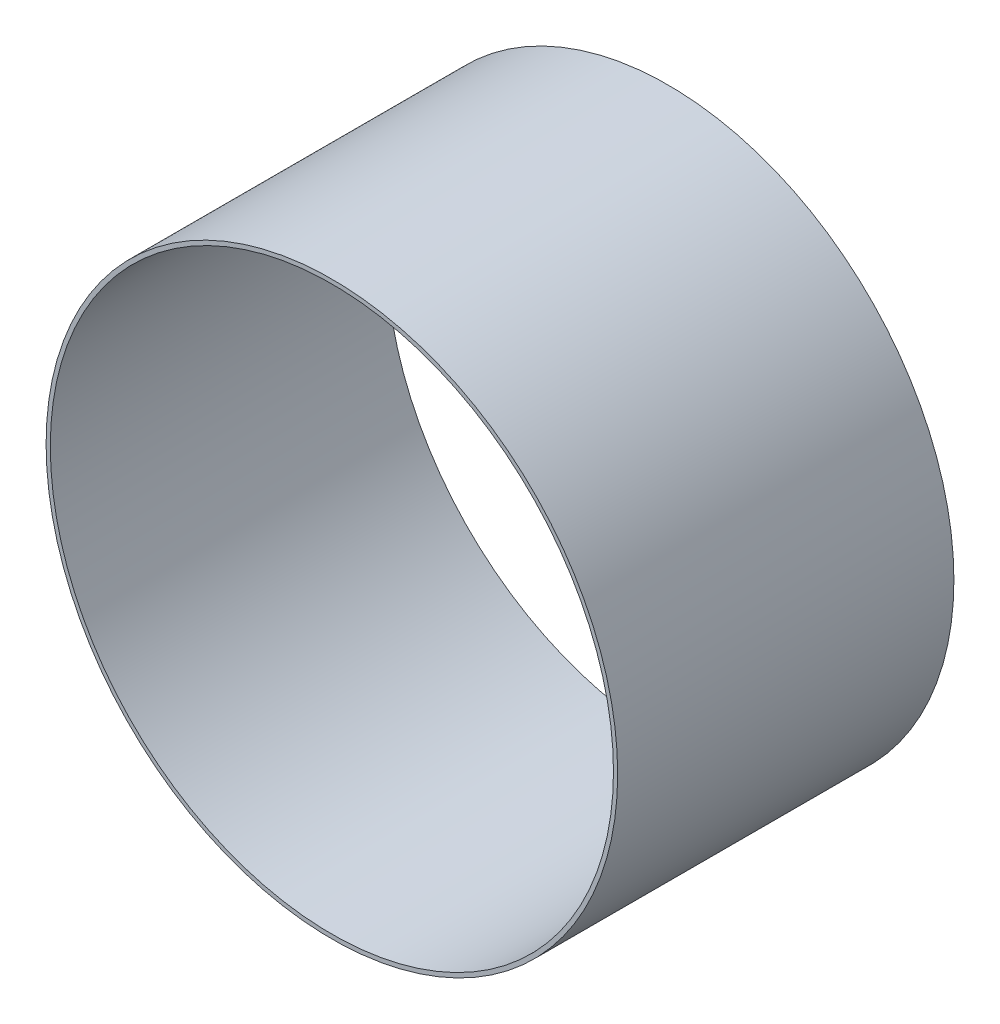
ISO-10303-21;
HEADER;
FILE_DESCRIPTION(('STEP AP214'),'2;1');
FILE_NAME('part.step','',(''),(''),'','','');
FILE_SCHEMA(('AUTOMOTIVE_DESIGN { 1 0 10303 214 1 1 1 1 }'));
ENDSEC;
DATA;
#1=APPLICATION_CONTEXT('core data for automotive mechanical design processes');
#2=APPLICATION_PROTOCOL_DEFINITION('international standard','automotive_design',2000,#1);
#3=PRODUCT_CONTEXT('',#1,'mechanical');
#4=PRODUCT('Part','Part','',(#3));
#5=PRODUCT_RELATED_PRODUCT_CATEGORY('part','',(#4));
#6=PRODUCT_DEFINITION_FORMATION('','',#4);
#7=PRODUCT_DEFINITION_CONTEXT('part definition',#1,'design');
#8=PRODUCT_DEFINITION('design','',#6,#7);
#9=PRODUCT_DEFINITION_SHAPE('','',#8);
#10=(LENGTH_UNIT() NAMED_UNIT(*) SI_UNIT(.MILLI.,.METRE.));
#11=(NAMED_UNIT(*) PLANE_ANGLE_UNIT() SI_UNIT($,.RADIAN.));
#12=(NAMED_UNIT(*) SI_UNIT($,.STERADIAN.) SOLID_ANGLE_UNIT());
#13=UNCERTAINTY_MEASURE_WITH_UNIT(LENGTH_MEASURE(1.E-05),#10,'distance_accuracy_value','');
#14=(GEOMETRIC_REPRESENTATION_CONTEXT(3) GLOBAL_UNCERTAINTY_ASSIGNED_CONTEXT((#13)) GLOBAL_UNIT_ASSIGNED_CONTEXT((#10,
#11,#12)) REPRESENTATION_CONTEXT('',''));
#15=CARTESIAN_POINT('',(0.,0.,0.));
#16=DIRECTION('',(0.,0.,1.));
#17=DIRECTION('',(1.,0.,0.));
#18=AXIS2_PLACEMENT_3D('',#15,#16,#17);
#19=CARTESIAN_POINT('',(0.,0.,-40.));
#20=DIRECTION('',(0.,0.,1.));
#21=DIRECTION('',(1.,0.,0.));
#22=AXIS2_PLACEMENT_3D('',#19,#20,#21);
#23=CYLINDRICAL_SURFACE('',#22,68.);
#24=CARTESIAN_POINT('',(0.,0.,-40.));
#25=DIRECTION('',(0.,0.,1.));
#26=DIRECTION('',(1.,0.,0.));
#27=AXIS2_PLACEMENT_3D('',#24,#25,#26);
#28=CIRCLE('',#27,68.);
#29=CARTESIAN_POINT('',(68.,0.,-40.));
#30=VERTEX_POINT('',#29);
#31=EDGE_CURVE('E10',#30,#30,#28,.T.);
#32=ORIENTED_EDGE('',*,*,#31,.T.);
#33=EDGE_LOOP('',(#32));
#34=FACE_BOUND('',#33,.T.);
#35=CARTESIAN_POINT('',(0.,0.,40.));
#36=DIRECTION('',(0.,0.,1.));
#37=DIRECTION('',(1.,0.,0.));
#38=AXIS2_PLACEMENT_3D('',#35,#36,#37);
#39=CIRCLE('',#38,68.);
#40=CARTESIAN_POINT('',(68.,0.,40.));
#41=VERTEX_POINT('',#40);
#42=EDGE_CURVE('E44',#41,#41,#39,.T.);
#43=ORIENTED_EDGE('',*,*,#42,.F.);
#44=EDGE_LOOP('',(#43));
#45=FACE_BOUND('',#44,.T.);
#46=ADVANCED_FACE('F37',(#34,#45),#23,.T.);
#47=CARTESIAN_POINT('',(0.,0.,-40.));
#48=DIRECTION('',(0.,0.,1.));
#49=DIRECTION('',(1.,0.,0.));
#50=AXIS2_PLACEMENT_3D('',#47,#48,#49);
#51=PLANE('',#50);
#52=CARTESIAN_POINT('',(0.,0.,-40.));
#53=DIRECTION('',(0.,0.,-1.));
#54=DIRECTION('',(-1.,0.,0.));
#55=AXIS2_PLACEMENT_3D('',#52,#53,#54);
#56=CIRCLE('',#55,67.);
#57=CARTESIAN_POINT('',(-67.,0.,-40.));
#58=VERTEX_POINT('',#57);
#59=EDGE_CURVE('E54',#58,#58,#56,.T.);
#60=ORIENTED_EDGE('',*,*,#59,.F.);
#61=EDGE_LOOP('',(#60));
#62=FACE_BOUND('',#61,.T.);
#63=ORIENTED_EDGE('',*,*,#31,.F.);
#64=EDGE_LOOP('',(#63));
#65=FACE_BOUND('',#64,.T.);
#66=ADVANCED_FACE('F63',(#62,#65),#51,.F.);
#67=CARTESIAN_POINT('',(0.,0.,40.));
#68=DIRECTION('',(0.,0.,1.));
#69=DIRECTION('',(1.,0.,0.));
#70=AXIS2_PLACEMENT_3D('',#67,#68,#69);
#71=PLANE('',#70);
#72=CARTESIAN_POINT('',(0.,0.,40.));
#73=DIRECTION('',(0.,0.,-1.));
#74=DIRECTION('',(-1.,0.,0.));
#75=AXIS2_PLACEMENT_3D('',#72,#73,#74);
#76=CIRCLE('',#75,67.);
#77=CARTESIAN_POINT('',(-67.,0.,40.));
#78=VERTEX_POINT('',#77);
#79=EDGE_CURVE('E49',#78,#78,#76,.T.);
#80=ORIENTED_EDGE('',*,*,#79,.T.);
#81=EDGE_LOOP('',(#80));
#82=FACE_BOUND('',#81,.T.);
#83=ORIENTED_EDGE('',*,*,#42,.T.);
#84=EDGE_LOOP('',(#83));
#85=FACE_BOUND('',#84,.T.);
#86=ADVANCED_FACE('F66',(#82,#85),#71,.T.);
#87=CARTESIAN_POINT('',(0.,0.,40.));
#88=DIRECTION('',(0.,0.,-1.));
#89=DIRECTION('',(-1.,0.,0.));
#90=AXIS2_PLACEMENT_3D('',#87,#88,#89);
#91=CYLINDRICAL_SURFACE('',#90,67.);
#92=ORIENTED_EDGE('',*,*,#79,.F.);
#93=EDGE_LOOP('',(#92));
#94=FACE_BOUND('',#93,.T.);
#95=ORIENTED_EDGE('',*,*,#59,.T.);
#96=EDGE_LOOP('',(#95));
#97=FACE_BOUND('',#96,.T.);
#98=ADVANCED_FACE('F61',(#94,#97),#91,.F.);
#99=CLOSED_SHELL('',(#46,#66,#86,#98));
#100=MANIFOLD_SOLID_BREP('B2',#99);
#101=ADVANCED_BREP_SHAPE_REPRESENTATION('',(#18,#100),#14);
#102=SHAPE_DEFINITION_REPRESENTATION(#9,#101);
ENDSEC;
END-ISO-10303-21;
